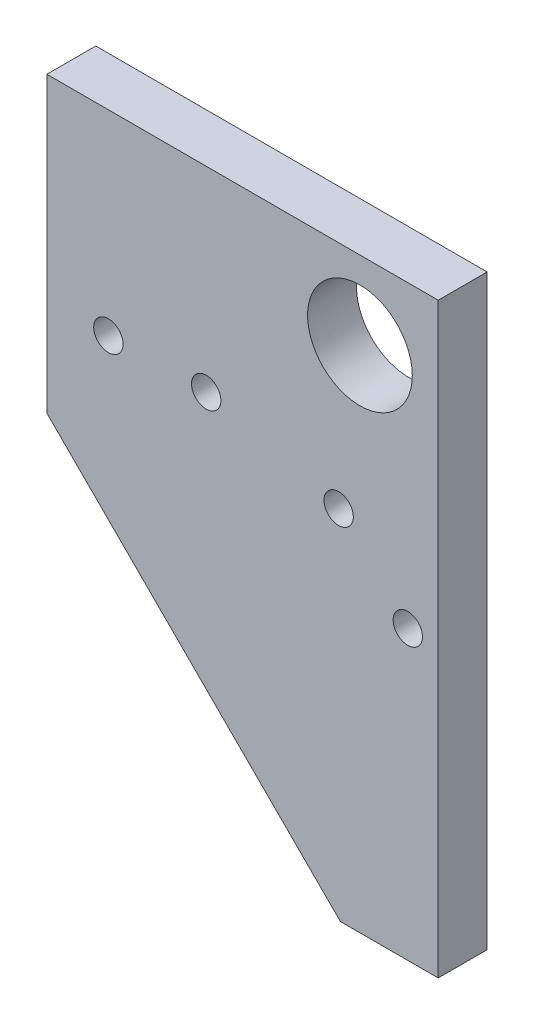
ISO-10303-21;
HEADER;
FILE_DESCRIPTION(('STEP AP214'),'2;1');
FILE_NAME('part.step','',(''),(''),'','','');
FILE_SCHEMA(('AUTOMOTIVE_DESIGN { 1 0 10303 214 1 1 1 1 }'));
ENDSEC;
DATA;
#1=APPLICATION_CONTEXT('core data for automotive mechanical design processes');
#2=APPLICATION_PROTOCOL_DEFINITION('international standard','automotive_design',2000,#1);
#3=PRODUCT_CONTEXT('',#1,'mechanical');
#4=PRODUCT('Part','Part','',(#3));
#5=PRODUCT_RELATED_PRODUCT_CATEGORY('part','',(#4));
#6=PRODUCT_DEFINITION_FORMATION('','',#4);
#7=PRODUCT_DEFINITION_CONTEXT('part definition',#1,'design');
#8=PRODUCT_DEFINITION('design','',#6,#7);
#9=PRODUCT_DEFINITION_SHAPE('','',#8);
#10=(LENGTH_UNIT() NAMED_UNIT(*) SI_UNIT(.MILLI.,.METRE.));
#11=(NAMED_UNIT(*) PLANE_ANGLE_UNIT() SI_UNIT($,.RADIAN.));
#12=(NAMED_UNIT(*) SI_UNIT($,.STERADIAN.) SOLID_ANGLE_UNIT());
#13=UNCERTAINTY_MEASURE_WITH_UNIT(LENGTH_MEASURE(1.E-05),#10,'distance_accuracy_value','');
#14=(GEOMETRIC_REPRESENTATION_CONTEXT(3) GLOBAL_UNCERTAINTY_ASSIGNED_CONTEXT((#13)) GLOBAL_UNIT_ASSIGNED_CONTEXT((#10,
#11,#12)) REPRESENTATION_CONTEXT('',''));
#15=CARTESIAN_POINT('',(0.,0.,0.));
#16=DIRECTION('',(0.,0.,1.));
#17=DIRECTION('',(1.,0.,0.));
#18=AXIS2_PLACEMENT_3D('',#15,#16,#17);
#19=CARTESIAN_POINT('',(0.,0.,5.));
#20=DIRECTION('',(0.,0.,-1.));
#21=DIRECTION('',(-1.,0.,0.));
#22=AXIS2_PLACEMENT_3D('',#19,#20,#21);
#23=PLANE('',#22);
#24=CARTESIAN_POINT('',(9.58232665287185,-27.3596092073373,5.));
#25=DIRECTION('',(0.,0.,1.));
#26=DIRECTION('',(1.,0.,0.));
#27=AXIS2_PLACEMENT_3D('',#24,#25,#26);
#28=CIRCLE('',#27,5.35);
#29=CARTESIAN_POINT('',(14.9323266528718,-27.3596092073373,5.));
#30=VERTEX_POINT('',#29);
#31=EDGE_CURVE('E172',#30,#30,#28,.T.);
#32=ORIENTED_EDGE('',*,*,#31,.F.);
#33=EDGE_LOOP('',(#32));
#34=FACE_BOUND('',#33,.T.);
#35=DIRECTION('',(0.707106781186547,-0.707106781186549,0.));
#36=VECTOR('',#35,1.);
#37=CARTESIAN_POINT('',(7.58232665287186,-79.3596092073374,5.));
#38=LINE('',#37,#36);
#39=CARTESIAN_POINT('',(-22.4176733471282,-49.3596092073373,5.));
#40=VERTEX_POINT('',#39);
#41=CARTESIAN_POINT('',(7.58232665287186,-79.3596092073374,5.));
#42=VERTEX_POINT('',#41);
#43=EDGE_CURVE('E119',#40,#42,#38,.T.);
#44=ORIENTED_EDGE('',*,*,#43,.T.);
#45=DIRECTION('',(1.,0.,0.));
#46=VECTOR('',#45,1.);
#47=CARTESIAN_POINT('',(17.5823266528719,-79.3596092073374,5.));
#48=LINE('',#47,#46);
#49=CARTESIAN_POINT('',(17.5823266528719,-79.3596092073374,5.));
#50=VERTEX_POINT('',#49);
#51=EDGE_CURVE('E86',#42,#50,#48,.T.);
#52=ORIENTED_EDGE('',*,*,#51,.T.);
#53=DIRECTION('',(0.,1.,0.));
#54=VECTOR('',#53,1.);
#55=CARTESIAN_POINT('',(17.5823266528718,-19.3596092073373,5.));
#56=LINE('',#55,#54);
#57=CARTESIAN_POINT('',(17.5823266528718,-19.3596092073373,5.));
#58=VERTEX_POINT('',#57);
#59=EDGE_CURVE('E90',#50,#58,#56,.T.);
#60=ORIENTED_EDGE('',*,*,#59,.T.);
#61=DIRECTION('',(-1.,0.,0.));
#62=VECTOR('',#61,1.);
#63=CARTESIAN_POINT('',(-22.4176733471282,-19.3596092073373,5.));
#64=LINE('',#63,#62);
#65=CARTESIAN_POINT('',(-22.4176733471282,-19.3596092073373,5.));
#66=VERTEX_POINT('',#65);
#67=EDGE_CURVE('E94',#58,#66,#64,.T.);
#68=ORIENTED_EDGE('',*,*,#67,.T.);
#69=DIRECTION('',(0.,-1.,0.));
#70=VECTOR('',#69,1.);
#71=CARTESIAN_POINT('',(-22.4176733471282,-49.3596092073373,5.));
#72=LINE('',#71,#70);
#73=EDGE_CURVE('E52',#66,#40,#72,.T.);
#74=ORIENTED_EDGE('',*,*,#73,.T.);
#75=EDGE_LOOP('',(#44,#52,#60,#68,#74));
#76=FACE_BOUND('',#75,.T.);
#77=CARTESIAN_POINT('',(-16.1305082894262,-39.3596092073373,5.));
#78=DIRECTION('',(0.,0.,1.));
#79=DIRECTION('',(1.,0.,0.));
#80=AXIS2_PLACEMENT_3D('',#77,#78,#79);
#81=CIRCLE('',#80,1.5);
#82=CARTESIAN_POINT('',(-14.6305082894262,-39.3596092073373,5.));
#83=VERTEX_POINT('',#82);
#84=EDGE_CURVE('E114',#83,#83,#81,.T.);
#85=ORIENTED_EDGE('',*,*,#84,.F.);
#86=EDGE_LOOP('',(#85));
#87=FACE_BOUND('',#86,.T.);
#88=CARTESIAN_POINT('',(-6.13050828942622,-39.3596092073373,5.));
#89=DIRECTION('',(0.,0.,1.));
#90=DIRECTION('',(1.,0.,0.));
#91=AXIS2_PLACEMENT_3D('',#88,#89,#90);
#92=CIRCLE('',#91,1.5);
#93=CARTESIAN_POINT('',(-4.63050828942622,-39.3596092073373,5.));
#94=VERTEX_POINT('',#93);
#95=EDGE_CURVE('E189',#94,#94,#92,.T.);
#96=ORIENTED_EDGE('',*,*,#95,.F.);
#97=EDGE_LOOP('',(#96));
#98=FACE_BOUND('',#97,.T.);
#99=CARTESIAN_POINT('',(7.40502561650652,-42.89514311327,5.));
#100=DIRECTION('',(0.,0.,1.));
#101=DIRECTION('',(1.,0.,0.));
#102=AXIS2_PLACEMENT_3D('',#99,#100,#101);
#103=CIRCLE('',#102,1.49999999999999);
#104=CARTESIAN_POINT('',(8.90502561650651,-42.89514311327,5.));
#105=VERTEX_POINT('',#104);
#106=EDGE_CURVE('E183',#105,#105,#103,.T.);
#107=ORIENTED_EDGE('',*,*,#106,.F.);
#108=EDGE_LOOP('',(#107));
#109=FACE_BOUND('',#108,.T.);
#110=CARTESIAN_POINT('',(14.476093428372,-49.9662109251355,5.));
#111=DIRECTION('',(0.,0.,1.));
#112=DIRECTION('',(1.,0.,0.));
#113=AXIS2_PLACEMENT_3D('',#110,#111,#112);
#114=CIRCLE('',#113,1.49999999999999);
#115=CARTESIAN_POINT('',(15.976093428372,-49.9662109251355,5.));
#116=VERTEX_POINT('',#115);
#117=EDGE_CURVE('E177',#116,#116,#114,.T.);
#118=ORIENTED_EDGE('',*,*,#117,.F.);
#119=EDGE_LOOP('',(#118));
#120=FACE_BOUND('',#119,.T.);
#121=ADVANCED_FACE('F35',(#34,#76,#87,#98,#109,#120),#23,.F.);
#122=CARTESIAN_POINT('',(0.,0.,0.));
#123=DIRECTION('',(0.,0.,-1.));
#124=DIRECTION('',(-1.,0.,0.));
#125=AXIS2_PLACEMENT_3D('',#122,#123,#124);
#126=PLANE('',#125);
#127=CARTESIAN_POINT('',(9.58232665287185,-27.3596092073373,0.));
#128=DIRECTION('',(0.,0.,1.));
#129=DIRECTION('',(1.,0.,0.));
#130=AXIS2_PLACEMENT_3D('',#127,#128,#129);
#131=CIRCLE('',#130,5.35);
#132=CARTESIAN_POINT('',(14.9323266528718,-27.3596092073373,0.));
#133=VERTEX_POINT('',#132);
#134=EDGE_CURVE('E170',#133,#133,#131,.T.);
#135=ORIENTED_EDGE('',*,*,#134,.T.);
#136=EDGE_LOOP('',(#135));
#137=FACE_BOUND('',#136,.T.);
#138=CARTESIAN_POINT('',(14.476093428372,-49.9662109251355,0.));
#139=DIRECTION('',(0.,0.,1.));
#140=DIRECTION('',(1.,0.,0.));
#141=AXIS2_PLACEMENT_3D('',#138,#139,#140);
#142=CIRCLE('',#141,1.49999999999999);
#143=CARTESIAN_POINT('',(15.976093428372,-49.9662109251355,0.));
#144=VERTEX_POINT('',#143);
#145=EDGE_CURVE('E174',#144,#144,#142,.T.);
#146=ORIENTED_EDGE('',*,*,#145,.T.);
#147=EDGE_LOOP('',(#146));
#148=FACE_BOUND('',#147,.T.);
#149=CARTESIAN_POINT('',(-6.13050828942622,-39.3596092073373,0.));
#150=DIRECTION('',(0.,0.,1.));
#151=DIRECTION('',(1.,0.,0.));
#152=AXIS2_PLACEMENT_3D('',#149,#150,#151);
#153=CIRCLE('',#152,1.5);
#154=CARTESIAN_POINT('',(-4.63050828942622,-39.3596092073373,0.));
#155=VERTEX_POINT('',#154);
#156=EDGE_CURVE('E186',#155,#155,#153,.T.);
#157=ORIENTED_EDGE('',*,*,#156,.T.);
#158=EDGE_LOOP('',(#157));
#159=FACE_BOUND('',#158,.T.);
#160=DIRECTION('',(0.707106781186547,-0.707106781186549,0.));
#161=VECTOR('',#160,1.);
#162=CARTESIAN_POINT('',(7.58232665287186,-79.3596092073374,0.));
#163=LINE('',#162,#161);
#164=CARTESIAN_POINT('',(-22.4176733471282,-49.3596092073373,0.));
#165=VERTEX_POINT('',#164);
#166=CARTESIAN_POINT('',(7.58232665287186,-79.3596092073374,0.));
#167=VERTEX_POINT('',#166);
#168=EDGE_CURVE('E110',#165,#167,#163,.T.);
#169=ORIENTED_EDGE('',*,*,#168,.F.);
#170=DIRECTION('',(0.,-1.,0.));
#171=VECTOR('',#170,1.);
#172=CARTESIAN_POINT('',(-22.4176733471282,-49.3596092073373,0.));
#173=LINE('',#172,#171);
#174=CARTESIAN_POINT('',(-22.4176733471282,-19.3596092073373,0.));
#175=VERTEX_POINT('',#174);
#176=EDGE_CURVE('E78',#175,#165,#173,.T.);
#177=ORIENTED_EDGE('',*,*,#176,.F.);
#178=DIRECTION('',(-1.,0.,0.));
#179=VECTOR('',#178,1.);
#180=CARTESIAN_POINT('',(-22.4176733471282,-19.3596092073373,0.));
#181=LINE('',#180,#179);
#182=CARTESIAN_POINT('',(17.5823266528718,-19.3596092073373,0.));
#183=VERTEX_POINT('',#182);
#184=EDGE_CURVE('E72',#183,#175,#181,.T.);
#185=ORIENTED_EDGE('',*,*,#184,.F.);
#186=DIRECTION('',(0.,1.,0.));
#187=VECTOR('',#186,1.);
#188=CARTESIAN_POINT('',(17.5823266528718,-19.3596092073373,0.));
#189=LINE('',#188,#187);
#190=CARTESIAN_POINT('',(17.5823266528719,-79.3596092073374,0.));
#191=VERTEX_POINT('',#190);
#192=EDGE_CURVE('E101',#191,#183,#189,.T.);
#193=ORIENTED_EDGE('',*,*,#192,.F.);
#194=DIRECTION('',(1.,0.,0.));
#195=VECTOR('',#194,1.);
#196=CARTESIAN_POINT('',(17.5823266528719,-79.3596092073374,0.));
#197=LINE('',#196,#195);
#198=EDGE_CURVE('E113',#167,#191,#197,.T.);
#199=ORIENTED_EDGE('',*,*,#198,.F.);
#200=EDGE_LOOP('',(#169,#177,#185,#193,#199));
#201=FACE_BOUND('',#200,.T.);
#202=CARTESIAN_POINT('',(-16.1305082894262,-39.3596092073373,0.));
#203=DIRECTION('',(0.,0.,1.));
#204=DIRECTION('',(1.,0.,0.));
#205=AXIS2_PLACEMENT_3D('',#202,#203,#204);
#206=CIRCLE('',#205,1.5);
#207=CARTESIAN_POINT('',(-14.6305082894262,-39.3596092073373,0.));
#208=VERTEX_POINT('',#207);
#209=EDGE_CURVE('E192',#208,#208,#206,.T.);
#210=ORIENTED_EDGE('',*,*,#209,.T.);
#211=EDGE_LOOP('',(#210));
#212=FACE_BOUND('',#211,.T.);
#213=CARTESIAN_POINT('',(7.40502561650652,-42.89514311327,0.));
#214=DIRECTION('',(0.,0.,1.));
#215=DIRECTION('',(1.,0.,0.));
#216=AXIS2_PLACEMENT_3D('',#213,#214,#215);
#217=CIRCLE('',#216,1.49999999999999);
#218=CARTESIAN_POINT('',(8.90502561650651,-42.89514311327,0.));
#219=VERTEX_POINT('',#218);
#220=EDGE_CURVE('E180',#219,#219,#217,.T.);
#221=ORIENTED_EDGE('',*,*,#220,.T.);
#222=EDGE_LOOP('',(#221));
#223=FACE_BOUND('',#222,.T.);
#224=ADVANCED_FACE('F123',(#137,#148,#159,#201,#212,#223),#126,.T.);
#225=CARTESIAN_POINT('',(7.58232665287186,-79.3596092073374,5.));
#226=DIRECTION('',(0.707106781186549,0.707106781186547,0.));
#227=DIRECTION('',(-0.707106781186546,0.707106781186549,0.));
#228=AXIS2_PLACEMENT_3D('',#225,#226,#227);
#229=PLANE('',#228);
#230=ORIENTED_EDGE('',*,*,#168,.T.);
#231=DIRECTION('',(0.,0.,-1.));
#232=VECTOR('',#231,1.);
#233=CARTESIAN_POINT('',(7.58232665287186,-79.3596092073374,5.));
#234=LINE('',#233,#232);
#235=EDGE_CURVE('E11',#42,#167,#234,.T.);
#236=ORIENTED_EDGE('',*,*,#235,.F.);
#237=ORIENTED_EDGE('',*,*,#43,.F.);
#238=DIRECTION('',(0.,0.,-1.));
#239=VECTOR('',#238,1.);
#240=CARTESIAN_POINT('',(-22.4176733471282,-49.3596092073373,5.));
#241=LINE('',#240,#239);
#242=EDGE_CURVE('E106',#40,#165,#241,.T.);
#243=ORIENTED_EDGE('',*,*,#242,.T.);
#244=EDGE_LOOP('',(#230,#236,#237,#243));
#245=FACE_BOUND('',#244,.T.);
#246=ADVANCED_FACE('F37',(#245),#229,.F.);
#247=CARTESIAN_POINT('',(17.5823266528719,-79.3596092073374,5.));
#248=DIRECTION('',(0.,1.,0.));
#249=DIRECTION('',(0.,0.,1.));
#250=AXIS2_PLACEMENT_3D('',#247,#248,#249);
#251=PLANE('',#250);
#252=ORIENTED_EDGE('',*,*,#198,.T.);
#253=DIRECTION('',(0.,0.,-1.));
#254=VECTOR('',#253,1.);
#255=CARTESIAN_POINT('',(17.5823266528719,-79.3596092073374,5.));
#256=LINE('',#255,#254);
#257=EDGE_CURVE('E44',#50,#191,#256,.T.);
#258=ORIENTED_EDGE('',*,*,#257,.F.);
#259=ORIENTED_EDGE('',*,*,#51,.F.);
#260=ORIENTED_EDGE('',*,*,#235,.T.);
#261=EDGE_LOOP('',(#252,#258,#259,#260));
#262=FACE_BOUND('',#261,.T.);
#263=ADVANCED_FACE('F251',(#262),#251,.F.);
#264=CARTESIAN_POINT('',(17.5823266528718,-19.3596092073373,5.));
#265=DIRECTION('',(-1.,0.,0.));
#266=DIRECTION('',(0.,-1.,0.));
#267=AXIS2_PLACEMENT_3D('',#264,#265,#266);
#268=PLANE('',#267);
#269=ORIENTED_EDGE('',*,*,#192,.T.);
#270=DIRECTION('',(0.,0.,-1.));
#271=VECTOR('',#270,1.);
#272=CARTESIAN_POINT('',(17.5823266528718,-19.3596092073373,5.));
#273=LINE('',#272,#271);
#274=EDGE_CURVE('E98',#58,#183,#273,.T.);
#275=ORIENTED_EDGE('',*,*,#274,.F.);
#276=ORIENTED_EDGE('',*,*,#59,.F.);
#277=ORIENTED_EDGE('',*,*,#257,.T.);
#278=EDGE_LOOP('',(#269,#275,#276,#277));
#279=FACE_BOUND('',#278,.T.);
#280=ADVANCED_FACE('F99',(#279),#268,.F.);
#281=CARTESIAN_POINT('',(-22.4176733471282,-19.3596092073373,5.));
#282=DIRECTION('',(0.,-1.,0.));
#283=DIRECTION('',(1.,0.,0.));
#284=AXIS2_PLACEMENT_3D('',#281,#282,#283);
#285=PLANE('',#284);
#286=ORIENTED_EDGE('',*,*,#184,.T.);
#287=DIRECTION('',(0.,0.,-1.));
#288=VECTOR('',#287,1.);
#289=CARTESIAN_POINT('',(-22.4176733471282,-19.3596092073373,5.));
#290=LINE('',#289,#288);
#291=EDGE_CURVE('E102',#66,#175,#290,.T.);
#292=ORIENTED_EDGE('',*,*,#291,.F.);
#293=ORIENTED_EDGE('',*,*,#67,.F.);
#294=ORIENTED_EDGE('',*,*,#274,.T.);
#295=EDGE_LOOP('',(#286,#292,#293,#294));
#296=FACE_BOUND('',#295,.T.);
#297=ADVANCED_FACE('F104',(#296),#285,.F.);
#298=CARTESIAN_POINT('',(-22.4176733471282,-49.3596092073373,5.));
#299=DIRECTION('',(1.,0.,0.));
#300=DIRECTION('',(0.,0.,-1.));
#301=AXIS2_PLACEMENT_3D('',#298,#299,#300);
#302=PLANE('',#301);
#303=ORIENTED_EDGE('',*,*,#176,.T.);
#304=ORIENTED_EDGE('',*,*,#242,.F.);
#305=ORIENTED_EDGE('',*,*,#73,.F.);
#306=ORIENTED_EDGE('',*,*,#291,.T.);
#307=EDGE_LOOP('',(#303,#304,#305,#306));
#308=FACE_BOUND('',#307,.T.);
#309=ADVANCED_FACE('F128',(#308),#302,.F.);
#310=CARTESIAN_POINT('',(-16.1305082894262,-39.3596092073373,5.));
#311=DIRECTION('',(0.,0.,-1.));
#312=DIRECTION('',(-1.,0.,0.));
#313=AXIS2_PLACEMENT_3D('',#310,#311,#312);
#314=CYLINDRICAL_SURFACE('',#313,1.5);
#315=ORIENTED_EDGE('',*,*,#84,.T.);
#316=EDGE_LOOP('',(#315));
#317=FACE_BOUND('',#316,.T.);
#318=ORIENTED_EDGE('',*,*,#209,.F.);
#319=EDGE_LOOP('',(#318));
#320=FACE_BOUND('',#319,.T.);
#321=ADVANCED_FACE('F130',(#317,#320),#314,.F.);
#322=CARTESIAN_POINT('',(-6.13050828942622,-39.3596092073373,5.));
#323=DIRECTION('',(0.,0.,-1.));
#324=DIRECTION('',(-1.,0.,0.));
#325=AXIS2_PLACEMENT_3D('',#322,#323,#324);
#326=CYLINDRICAL_SURFACE('',#325,1.5);
#327=ORIENTED_EDGE('',*,*,#95,.T.);
#328=EDGE_LOOP('',(#327));
#329=FACE_BOUND('',#328,.T.);
#330=ORIENTED_EDGE('',*,*,#156,.F.);
#331=EDGE_LOOP('',(#330));
#332=FACE_BOUND('',#331,.T.);
#333=ADVANCED_FACE('F136',(#329,#332),#326,.F.);
#334=CARTESIAN_POINT('',(7.40502561650652,-42.89514311327,5.));
#335=DIRECTION('',(0.,0.,-1.));
#336=DIRECTION('',(-1.,0.,0.));
#337=AXIS2_PLACEMENT_3D('',#334,#335,#336);
#338=CYLINDRICAL_SURFACE('',#337,1.49999999999999);
#339=ORIENTED_EDGE('',*,*,#106,.T.);
#340=EDGE_LOOP('',(#339));
#341=FACE_BOUND('',#340,.T.);
#342=ORIENTED_EDGE('',*,*,#220,.F.);
#343=EDGE_LOOP('',(#342));
#344=FACE_BOUND('',#343,.T.);
#345=ADVANCED_FACE('F153',(#341,#344),#338,.F.);
#346=CARTESIAN_POINT('',(14.476093428372,-49.9662109251355,5.));
#347=DIRECTION('',(0.,0.,-1.));
#348=DIRECTION('',(-1.,0.,0.));
#349=AXIS2_PLACEMENT_3D('',#346,#347,#348);
#350=CYLINDRICAL_SURFACE('',#349,1.49999999999999);
#351=ORIENTED_EDGE('',*,*,#117,.T.);
#352=EDGE_LOOP('',(#351));
#353=FACE_BOUND('',#352,.T.);
#354=ORIENTED_EDGE('',*,*,#145,.F.);
#355=EDGE_LOOP('',(#354));
#356=FACE_BOUND('',#355,.T.);
#357=ADVANCED_FACE('F157',(#353,#356),#350,.F.);
#358=CARTESIAN_POINT('',(9.58232665287185,-27.3596092073373,0.));
#359=DIRECTION('',(0.,0.,1.));
#360=DIRECTION('',(1.,0.,0.));
#361=AXIS2_PLACEMENT_3D('',#358,#359,#360);
#362=CYLINDRICAL_SURFACE('',#361,5.35);
#363=ORIENTED_EDGE('',*,*,#134,.F.);
#364=EDGE_LOOP('',(#363));
#365=FACE_BOUND('',#364,.T.);
#366=ORIENTED_EDGE('',*,*,#31,.T.);
#367=EDGE_LOOP('',(#366));
#368=FACE_BOUND('',#367,.T.);
#369=ADVANCED_FACE('F161',(#365,#368),#362,.F.);
#370=CLOSED_SHELL('',(#121,#224,#246,#263,#280,#297,#309,#321,#333,#345,#357,#369));
#371=MANIFOLD_SOLID_BREP('B2',#370);
#372=ADVANCED_BREP_SHAPE_REPRESENTATION('',(#18,#371),#14);
#373=SHAPE_DEFINITION_REPRESENTATION(#9,#372);
ENDSEC;
END-ISO-10303-21;
